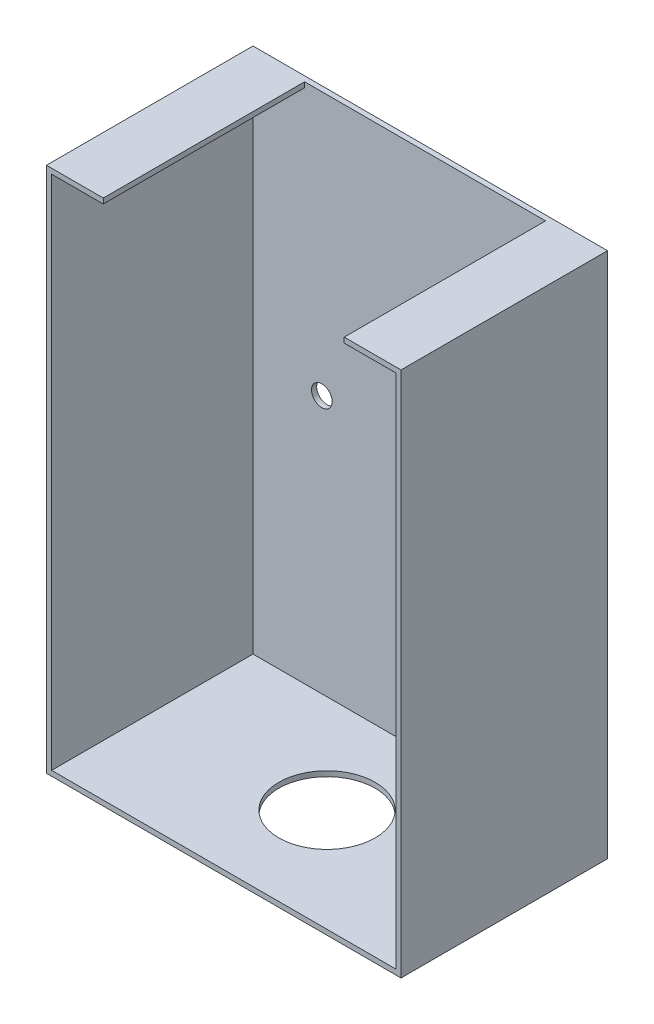
ISO-10303-21;
HEADER;
FILE_DESCRIPTION(('STEP AP214'),'2;1');
FILE_NAME('part.step','',(''),(''),'','','');
FILE_SCHEMA(('AUTOMOTIVE_DESIGN { 1 0 10303 214 1 1 1 1 }'));
ENDSEC;
DATA;
#1=APPLICATION_CONTEXT('core data for automotive mechanical design processes');
#2=APPLICATION_PROTOCOL_DEFINITION('international standard','automotive_design',2000,#1);
#3=PRODUCT_CONTEXT('',#1,'mechanical');
#4=PRODUCT('Part','Part','',(#3));
#5=PRODUCT_RELATED_PRODUCT_CATEGORY('part','',(#4));
#6=PRODUCT_DEFINITION_FORMATION('','',#4);
#7=PRODUCT_DEFINITION_CONTEXT('part definition',#1,'design');
#8=PRODUCT_DEFINITION('design','',#6,#7);
#9=PRODUCT_DEFINITION_SHAPE('','',#8);
#10=(LENGTH_UNIT() NAMED_UNIT(*) SI_UNIT(.MILLI.,.METRE.));
#11=(NAMED_UNIT(*) PLANE_ANGLE_UNIT() SI_UNIT($,.RADIAN.));
#12=(NAMED_UNIT(*) SI_UNIT($,.STERADIAN.) SOLID_ANGLE_UNIT());
#13=UNCERTAINTY_MEASURE_WITH_UNIT(LENGTH_MEASURE(1.E-05),#10,'distance_accuracy_value','');
#14=(GEOMETRIC_REPRESENTATION_CONTEXT(3) GLOBAL_UNCERTAINTY_ASSIGNED_CONTEXT((#13)) GLOBAL_UNIT_ASSIGNED_CONTEXT((#10,
#11,#12)) REPRESENTATION_CONTEXT('',''));
#15=CARTESIAN_POINT('',(0.,0.,0.));
#16=DIRECTION('',(0.,0.,1.));
#17=DIRECTION('',(1.,0.,0.));
#18=AXIS2_PLACEMENT_3D('',#15,#16,#17);
#19=CARTESIAN_POINT('',(50.,-76.5,60.));
#20=DIRECTION('',(-1.,0.,0.));
#21=DIRECTION('',(0.,0.,1.));
#22=AXIS2_PLACEMENT_3D('',#19,#20,#21);
#23=PLANE('',#22);
#24=DIRECTION('',(0.,1.,0.));
#25=VECTOR('',#24,1.);
#26=CARTESIAN_POINT('',(50.,-76.5,60.));
#27=LINE('',#26,#25);
#28=CARTESIAN_POINT('',(50.,-75.,60.));
#29=VERTEX_POINT('',#28);
#30=CARTESIAN_POINT('',(50.,75.,60.));
#31=VERTEX_POINT('',#30);
#32=EDGE_CURVE('E220',#29,#31,#27,.T.);
#33=ORIENTED_EDGE('',*,*,#32,.T.);
#34=DIRECTION('',(0.,0.,1.));
#35=VECTOR('',#34,1.);
#36=CARTESIAN_POINT('',(50.,75.,1.5));
#37=LINE('',#36,#35);
#38=CARTESIAN_POINT('',(50.,75.,1.5));
#39=VERTEX_POINT('',#38);
#40=EDGE_CURVE('E169',#39,#31,#37,.T.);
#41=ORIENTED_EDGE('',*,*,#40,.F.);
#42=DIRECTION('',(0.,1.,0.));
#43=VECTOR('',#42,1.);
#44=CARTESIAN_POINT('',(50.,-76.5,1.5));
#45=LINE('',#44,#43);
#46=CARTESIAN_POINT('',(50.,-75.,1.5));
#47=VERTEX_POINT('',#46);
#48=EDGE_CURVE('E216',#47,#39,#45,.T.);
#49=ORIENTED_EDGE('',*,*,#48,.F.);
#50=DIRECTION('',(0.,0.,-1.));
#51=VECTOR('',#50,1.);
#52=CARTESIAN_POINT('',(50.,-75.,60.));
#53=LINE('',#52,#51);
#54=EDGE_CURVE('E213',#29,#47,#53,.T.);
#55=ORIENTED_EDGE('',*,*,#54,.F.);
#56=EDGE_LOOP('',(#33,#41,#49,#55));
#57=FACE_BOUND('',#56,.T.);
#58=ADVANCED_FACE('F38',(#57),#23,.T.);
#59=CARTESIAN_POINT('',(0.,0.,1.5));
#60=DIRECTION('',(0.,0.,1.));
#61=DIRECTION('',(1.,0.,0.));
#62=AXIS2_PLACEMENT_3D('',#59,#60,#61);
#63=PLANE('',#62);
#64=CARTESIAN_POINT('',(30.,0.,1.5));
#65=DIRECTION('',(0.,0.,1.));
#66=DIRECTION('',(1.,0.,0.));
#67=AXIS2_PLACEMENT_3D('',#64,#65,#66);
#68=CIRCLE('',#67,3.);
#69=CARTESIAN_POINT('',(33.,0.,1.5));
#70=VERTEX_POINT('',#69);
#71=EDGE_CURVE('E462',#70,#70,#68,.F.);
#72=ORIENTED_EDGE('',*,*,#71,.T.);
#73=EDGE_LOOP('',(#72));
#74=FACE_BOUND('',#73,.T.);
#75=CARTESIAN_POINT('',(-30.,0.,1.5));
#76=DIRECTION('',(0.,0.,1.));
#77=DIRECTION('',(1.,0.,0.));
#78=AXIS2_PLACEMENT_3D('',#75,#76,#77);
#79=CIRCLE('',#78,3.);
#80=CARTESIAN_POINT('',(-27.,0.,1.5));
#81=VERTEX_POINT('',#80);
#82=EDGE_CURVE('E474',#81,#81,#79,.F.);
#83=ORIENTED_EDGE('',*,*,#82,.T.);
#84=EDGE_LOOP('',(#83));
#85=FACE_BOUND('',#84,.T.);
#86=DIRECTION('',(-1.,0.,0.));
#87=VECTOR('',#86,1.);
#88=CARTESIAN_POINT('',(-35.,75.,1.5));
#89=LINE('',#88,#87);
#90=CARTESIAN_POINT('',(-35.,75.,1.5));
#91=VERTEX_POINT('',#90);
#92=CARTESIAN_POINT('',(-50.,75.,1.5));
#93=VERTEX_POINT('',#92);
#94=EDGE_CURVE('E157',#91,#93,#89,.T.);
#95=ORIENTED_EDGE('',*,*,#94,.T.);
#96=DIRECTION('',(0.,-1.,0.));
#97=VECTOR('',#96,1.);
#98=CARTESIAN_POINT('',(-50.,-76.5,1.5));
#99=LINE('',#98,#97);
#100=CARTESIAN_POINT('',(-50.,-75.,1.5));
#101=VERTEX_POINT('',#100);
#102=EDGE_CURVE('E201',#93,#101,#99,.T.);
#103=ORIENTED_EDGE('',*,*,#102,.T.);
#104=DIRECTION('',(1.,0.,0.));
#105=VECTOR('',#104,1.);
#106=CARTESIAN_POINT('',(51.5,-75.,1.5));
#107=LINE('',#106,#105);
#108=EDGE_CURVE('E207',#101,#47,#107,.T.);
#109=ORIENTED_EDGE('',*,*,#108,.T.);
#110=ORIENTED_EDGE('',*,*,#48,.T.);
#111=DIRECTION('',(1.,0.,0.));
#112=VECTOR('',#111,1.);
#113=CARTESIAN_POINT('',(35.,75.,1.5));
#114=LINE('',#113,#112);
#115=CARTESIAN_POINT('',(35.,75.,1.5));
#116=VERTEX_POINT('',#115);
#117=EDGE_CURVE('E192',#116,#39,#114,.T.);
#118=ORIENTED_EDGE('',*,*,#117,.F.);
#119=DIRECTION('',(0.,-1.,0.));
#120=VECTOR('',#119,1.);
#121=CARTESIAN_POINT('',(35.,76.5,1.5));
#122=LINE('',#121,#120);
#123=CARTESIAN_POINT('',(35.,76.5,1.5));
#124=VERTEX_POINT('',#123);
#125=EDGE_CURVE('E170',#124,#116,#122,.T.);
#126=ORIENTED_EDGE('',*,*,#125,.F.);
#127=DIRECTION('',(-1.,0.,0.));
#128=VECTOR('',#127,1.);
#129=CARTESIAN_POINT('',(51.5,76.5,1.5));
#130=LINE('',#129,#128);
#131=CARTESIAN_POINT('',(-35.,76.5,1.5));
#132=VERTEX_POINT('',#131);
#133=EDGE_CURVE('E59',#124,#132,#130,.T.);
#134=ORIENTED_EDGE('',*,*,#133,.T.);
#135=DIRECTION('',(0.,-1.,0.));
#136=VECTOR('',#135,1.);
#137=CARTESIAN_POINT('',(-35.,76.5,1.5));
#138=LINE('',#137,#136);
#139=EDGE_CURVE('E54',#132,#91,#138,.T.);
#140=ORIENTED_EDGE('',*,*,#139,.T.);
#141=EDGE_LOOP('',(#95,#103,#109,#110,#118,#126,#134,#140));
#142=FACE_BOUND('',#141,.T.);
#143=ADVANCED_FACE('F285',(#74,#85,#142),#63,.T.);
#144=CARTESIAN_POINT('',(-51.5,-76.5,60.));
#145=DIRECTION('',(1.,0.,0.));
#146=DIRECTION('',(0.,0.,-1.));
#147=AXIS2_PLACEMENT_3D('',#144,#145,#146);
#148=PLANE('',#147);
#149=DIRECTION('',(0.,-1.,0.));
#150=VECTOR('',#149,1.);
#151=CARTESIAN_POINT('',(-51.5,-76.5,0.));
#152=LINE('',#151,#150);
#153=CARTESIAN_POINT('',(-51.5,76.5,0.));
#154=VERTEX_POINT('',#153);
#155=CARTESIAN_POINT('',(-51.5,-76.5,0.));
#156=VERTEX_POINT('',#155);
#157=EDGE_CURVE('E212',#154,#156,#152,.T.);
#158=ORIENTED_EDGE('',*,*,#157,.T.);
#159=DIRECTION('',(0.,0.,-1.));
#160=VECTOR('',#159,1.);
#161=CARTESIAN_POINT('',(-51.5,-76.5,60.));
#162=LINE('',#161,#160);
#163=CARTESIAN_POINT('',(-51.5,-76.5,60.));
#164=VERTEX_POINT('',#163);
#165=EDGE_CURVE('E11',#164,#156,#162,.T.);
#166=ORIENTED_EDGE('',*,*,#165,.F.);
#167=DIRECTION('',(0.,-1.,0.));
#168=VECTOR('',#167,1.);
#169=CARTESIAN_POINT('',(-51.5,-76.5,60.));
#170=LINE('',#169,#168);
#171=CARTESIAN_POINT('',(-51.5,76.5,60.));
#172=VERTEX_POINT('',#171);
#173=EDGE_CURVE('E235',#172,#164,#170,.T.);
#174=ORIENTED_EDGE('',*,*,#173,.F.);
#175=DIRECTION('',(0.,0.,-1.));
#176=VECTOR('',#175,1.);
#177=CARTESIAN_POINT('',(-51.5,76.5,60.));
#178=LINE('',#177,#176);
#179=EDGE_CURVE('E132',#172,#154,#178,.T.);
#180=ORIENTED_EDGE('',*,*,#179,.T.);
#181=EDGE_LOOP('',(#158,#166,#174,#180));
#182=FACE_BOUND('',#181,.T.);
#183=ADVANCED_FACE('F40',(#182),#148,.F.);
#184=CARTESIAN_POINT('',(51.5,-76.5,60.));
#185=DIRECTION('',(0.,1.,0.));
#186=DIRECTION('',(0.,0.,1.));
#187=AXIS2_PLACEMENT_3D('',#184,#185,#186);
#188=PLANE('',#187);
#189=CARTESIAN_POINT('',(0.,-76.5,30.));
#190=DIRECTION('',(0.,-1.,0.));
#191=DIRECTION('',(0.,0.,-1.));
#192=AXIS2_PLACEMENT_3D('',#189,#190,#191);
#193=CIRCLE('',#192,14.);
#194=CARTESIAN_POINT('',(0.,-76.5,16.));
#195=VERTEX_POINT('',#194);
#196=EDGE_CURVE('E197',#195,#195,#193,.T.);
#197=ORIENTED_EDGE('',*,*,#196,.F.);
#198=EDGE_LOOP('',(#197));
#199=FACE_BOUND('',#198,.T.);
#200=DIRECTION('',(1.,0.,0.));
#201=VECTOR('',#200,1.);
#202=CARTESIAN_POINT('',(51.5,-76.5,0.));
#203=LINE('',#202,#201);
#204=CARTESIAN_POINT('',(51.5,-76.5,0.));
#205=VERTEX_POINT('',#204);
#206=EDGE_CURVE('E248',#156,#205,#203,.T.);
#207=ORIENTED_EDGE('',*,*,#206,.T.);
#208=DIRECTION('',(0.,0.,-1.));
#209=VECTOR('',#208,1.);
#210=CARTESIAN_POINT('',(51.5,-76.5,60.));
#211=LINE('',#210,#209);
#212=CARTESIAN_POINT('',(51.5,-76.5,60.));
#213=VERTEX_POINT('',#212);
#214=EDGE_CURVE('E47',#213,#205,#211,.T.);
#215=ORIENTED_EDGE('',*,*,#214,.F.);
#216=DIRECTION('',(1.,0.,0.));
#217=VECTOR('',#216,1.);
#218=CARTESIAN_POINT('',(51.5,-76.5,60.));
#219=LINE('',#218,#217);
#220=EDGE_CURVE('E238',#164,#213,#219,.T.);
#221=ORIENTED_EDGE('',*,*,#220,.F.);
#222=ORIENTED_EDGE('',*,*,#165,.T.);
#223=EDGE_LOOP('',(#207,#215,#221,#222));
#224=FACE_BOUND('',#223,.T.);
#225=ADVANCED_FACE('F277',(#199,#224),#188,.F.);
#226=CARTESIAN_POINT('',(51.5,-76.5,60.));
#227=DIRECTION('',(-1.,0.,0.));
#228=DIRECTION('',(0.,0.,1.));
#229=AXIS2_PLACEMENT_3D('',#226,#227,#228);
#230=PLANE('',#229);
#231=DIRECTION('',(0.,1.,0.));
#232=VECTOR('',#231,1.);
#233=CARTESIAN_POINT('',(51.5,-76.5,0.));
#234=LINE('',#233,#232);
#235=CARTESIAN_POINT('',(51.5,76.5,0.));
#236=VERTEX_POINT('',#235);
#237=EDGE_CURVE('E251',#205,#236,#234,.T.);
#238=ORIENTED_EDGE('',*,*,#237,.T.);
#239=DIRECTION('',(0.,0.,-1.));
#240=VECTOR('',#239,1.);
#241=CARTESIAN_POINT('',(51.5,76.5,60.));
#242=LINE('',#241,#240);
#243=CARTESIAN_POINT('',(51.5,76.5,60.));
#244=VERTEX_POINT('',#243);
#245=EDGE_CURVE('E258',#244,#236,#242,.T.);
#246=ORIENTED_EDGE('',*,*,#245,.F.);
#247=DIRECTION('',(0.,1.,0.));
#248=VECTOR('',#247,1.);
#249=CARTESIAN_POINT('',(51.5,-76.5,60.));
#250=LINE('',#249,#248);
#251=EDGE_CURVE('E139',#213,#244,#250,.T.);
#252=ORIENTED_EDGE('',*,*,#251,.F.);
#253=ORIENTED_EDGE('',*,*,#214,.T.);
#254=EDGE_LOOP('',(#238,#246,#252,#253));
#255=FACE_BOUND('',#254,.T.);
#256=ADVANCED_FACE('F267',(#255),#230,.F.);
#257=CARTESIAN_POINT('',(51.5,76.5,60.));
#258=DIRECTION('',(0.,-1.,0.));
#259=DIRECTION('',(1.,0.,0.));
#260=AXIS2_PLACEMENT_3D('',#257,#258,#259);
#261=PLANE('',#260);
#262=DIRECTION('',(-1.,0.,0.));
#263=VECTOR('',#262,1.);
#264=CARTESIAN_POINT('',(51.5,76.5,60.));
#265=LINE('',#264,#263);
#266=CARTESIAN_POINT('',(-35.,76.5,60.));
#267=VERTEX_POINT('',#266);
#268=EDGE_CURVE('E127',#267,#172,#265,.T.);
#269=ORIENTED_EDGE('',*,*,#268,.F.);
#270=DIRECTION('',(0.,0.,-1.));
#271=VECTOR('',#270,1.);
#272=CARTESIAN_POINT('',(-35.,76.5,1.5));
#273=LINE('',#272,#271);
#274=EDGE_CURVE('E130',#267,#132,#273,.T.);
#275=ORIENTED_EDGE('',*,*,#274,.T.);
#276=ORIENTED_EDGE('',*,*,#133,.F.);
#277=DIRECTION('',(0.,0.,-1.));
#278=VECTOR('',#277,1.);
#279=CARTESIAN_POINT('',(35.,76.5,1.5));
#280=LINE('',#279,#278);
#281=CARTESIAN_POINT('',(35.,76.5,60.));
#282=VERTEX_POINT('',#281);
#283=EDGE_CURVE('E181',#282,#124,#280,.T.);
#284=ORIENTED_EDGE('',*,*,#283,.F.);
#285=EDGE_CURVE('E138',#244,#282,#265,.T.);
#286=ORIENTED_EDGE('',*,*,#285,.F.);
#287=ORIENTED_EDGE('',*,*,#245,.T.);
#288=DIRECTION('',(-1.,0.,0.));
#289=VECTOR('',#288,1.);
#290=CARTESIAN_POINT('',(51.5,76.5,0.));
#291=LINE('',#290,#289);
#292=EDGE_CURVE('E239',#236,#154,#291,.T.);
#293=ORIENTED_EDGE('',*,*,#292,.T.);
#294=ORIENTED_EDGE('',*,*,#179,.F.);
#295=EDGE_LOOP('',(#269,#275,#276,#284,#286,#287,#293,#294));
#296=FACE_BOUND('',#295,.T.);
#297=ADVANCED_FACE('F129',(#296),#261,.F.);
#298=CARTESIAN_POINT('',(0.,0.,60.));
#299=DIRECTION('',(0.,0.,1.));
#300=DIRECTION('',(1.,0.,0.));
#301=AXIS2_PLACEMENT_3D('',#298,#299,#300);
#302=PLANE('',#301);
#303=DIRECTION('',(0.,-1.,0.));
#304=VECTOR('',#303,1.);
#305=CARTESIAN_POINT('',(-50.,-76.5,60.));
#306=LINE('',#305,#304);
#307=CARTESIAN_POINT('',(-50.,75.,60.));
#308=VERTEX_POINT('',#307);
#309=CARTESIAN_POINT('',(-50.,-75.,60.));
#310=VERTEX_POINT('',#309);
#311=EDGE_CURVE('E224',#308,#310,#306,.T.);
#312=ORIENTED_EDGE('',*,*,#311,.F.);
#313=DIRECTION('',(-1.,0.,0.));
#314=VECTOR('',#313,1.);
#315=CARTESIAN_POINT('',(-35.,75.,60.));
#316=LINE('',#315,#314);
#317=CARTESIAN_POINT('',(-35.,75.,60.));
#318=VERTEX_POINT('',#317);
#319=EDGE_CURVE('E152',#318,#308,#316,.T.);
#320=ORIENTED_EDGE('',*,*,#319,.F.);
#321=DIRECTION('',(0.,1.,0.));
#322=VECTOR('',#321,1.);
#323=CARTESIAN_POINT('',(-35.,76.5,60.));
#324=LINE('',#323,#322);
#325=EDGE_CURVE('E145',#318,#267,#324,.T.);
#326=ORIENTED_EDGE('',*,*,#325,.T.);
#327=ORIENTED_EDGE('',*,*,#268,.T.);
#328=ORIENTED_EDGE('',*,*,#173,.T.);
#329=ORIENTED_EDGE('',*,*,#220,.T.);
#330=ORIENTED_EDGE('',*,*,#251,.T.);
#331=ORIENTED_EDGE('',*,*,#285,.T.);
#332=DIRECTION('',(0.,1.,0.));
#333=VECTOR('',#332,1.);
#334=CARTESIAN_POINT('',(35.,76.5,60.));
#335=LINE('',#334,#333);
#336=CARTESIAN_POINT('',(35.,75.,60.));
#337=VERTEX_POINT('',#336);
#338=EDGE_CURVE('E177',#337,#282,#335,.T.);
#339=ORIENTED_EDGE('',*,*,#338,.F.);
#340=DIRECTION('',(1.,0.,0.));
#341=VECTOR('',#340,1.);
#342=CARTESIAN_POINT('',(35.,75.,60.));
#343=LINE('',#342,#341);
#344=EDGE_CURVE('E185',#337,#31,#343,.T.);
#345=ORIENTED_EDGE('',*,*,#344,.T.);
#346=ORIENTED_EDGE('',*,*,#32,.F.);
#347=DIRECTION('',(1.,0.,0.));
#348=VECTOR('',#347,1.);
#349=CARTESIAN_POINT('',(51.5,-75.,60.));
#350=LINE('',#349,#348);
#351=EDGE_CURVE('E227',#310,#29,#350,.T.);
#352=ORIENTED_EDGE('',*,*,#351,.F.);
#353=EDGE_LOOP('',(#312,#320,#326,#327,#328,#329,#330,#331,#339,#345,#346,#352));
#354=FACE_BOUND('',#353,.T.);
#355=ADVANCED_FACE('F150',(#354),#302,.T.);
#356=CARTESIAN_POINT('',(0.,0.,0.));
#357=DIRECTION('',(0.,0.,1.));
#358=DIRECTION('',(1.,0.,0.));
#359=AXIS2_PLACEMENT_3D('',#356,#357,#358);
#360=PLANE('',#359);
#361=CARTESIAN_POINT('',(30.,0.,0.));
#362=DIRECTION('',(0.,0.,-1.));
#363=DIRECTION('',(-1.,0.,0.));
#364=AXIS2_PLACEMENT_3D('',#361,#362,#363);
#365=CIRCLE('',#364,3.);
#366=CARTESIAN_POINT('',(27.,0.,0.));
#367=VERTEX_POINT('',#366);
#368=EDGE_CURVE('E164',#367,#367,#365,.T.);
#369=ORIENTED_EDGE('',*,*,#368,.F.);
#370=EDGE_LOOP('',(#369));
#371=FACE_BOUND('',#370,.T.);
#372=CARTESIAN_POINT('',(-30.,0.,0.));
#373=DIRECTION('',(0.,0.,-1.));
#374=DIRECTION('',(1.,0.,0.));
#375=AXIS2_PLACEMENT_3D('',#372,#373,#374);
#376=CIRCLE('',#375,3.);
#377=CARTESIAN_POINT('',(-27.,0.,0.));
#378=VERTEX_POINT('',#377);
#379=EDGE_CURVE('E468',#378,#378,#376,.T.);
#380=ORIENTED_EDGE('',*,*,#379,.F.);
#381=EDGE_LOOP('',(#380));
#382=FACE_BOUND('',#381,.T.);
#383=ORIENTED_EDGE('',*,*,#157,.F.);
#384=ORIENTED_EDGE('',*,*,#292,.F.);
#385=ORIENTED_EDGE('',*,*,#237,.F.);
#386=ORIENTED_EDGE('',*,*,#206,.F.);
#387=EDGE_LOOP('',(#383,#384,#385,#386));
#388=FACE_BOUND('',#387,.T.);
#389=ADVANCED_FACE('F273',(#371,#382,#388),#360,.F.);
#390=CARTESIAN_POINT('',(-50.,-76.5,60.));
#391=DIRECTION('',(1.,0.,0.));
#392=DIRECTION('',(0.,0.,-1.));
#393=AXIS2_PLACEMENT_3D('',#390,#391,#392);
#394=PLANE('',#393);
#395=DIRECTION('',(0.,0.,1.));
#396=VECTOR('',#395,1.);
#397=CARTESIAN_POINT('',(-50.,75.,1.5));
#398=LINE('',#397,#396);
#399=EDGE_CURVE('E161',#93,#308,#398,.T.);
#400=ORIENTED_EDGE('',*,*,#399,.T.);
#401=ORIENTED_EDGE('',*,*,#311,.T.);
#402=DIRECTION('',(0.,0.,-1.));
#403=VECTOR('',#402,1.);
#404=CARTESIAN_POINT('',(-50.,-75.,60.));
#405=LINE('',#404,#403);
#406=EDGE_CURVE('E208',#310,#101,#405,.T.);
#407=ORIENTED_EDGE('',*,*,#406,.T.);
#408=ORIENTED_EDGE('',*,*,#102,.F.);
#409=EDGE_LOOP('',(#400,#401,#407,#408));
#410=FACE_BOUND('',#409,.T.);
#411=ADVANCED_FACE('F305',(#410),#394,.T.);
#412=CARTESIAN_POINT('',(51.5,-75.,60.));
#413=DIRECTION('',(0.,1.,0.));
#414=DIRECTION('',(0.,0.,1.));
#415=AXIS2_PLACEMENT_3D('',#412,#413,#414);
#416=PLANE('',#415);
#417=CARTESIAN_POINT('',(0.,-75.,30.));
#418=DIRECTION('',(0.,1.,0.));
#419=DIRECTION('',(0.,0.,1.));
#420=AXIS2_PLACEMENT_3D('',#417,#418,#419);
#421=CIRCLE('',#420,14.);
#422=CARTESIAN_POINT('',(0.,-75.,44.));
#423=VERTEX_POINT('',#422);
#424=EDGE_CURVE('E196',#423,#423,#421,.F.);
#425=ORIENTED_EDGE('',*,*,#424,.T.);
#426=EDGE_LOOP('',(#425));
#427=FACE_BOUND('',#426,.T.);
#428=ORIENTED_EDGE('',*,*,#108,.F.);
#429=ORIENTED_EDGE('',*,*,#406,.F.);
#430=ORIENTED_EDGE('',*,*,#351,.T.);
#431=ORIENTED_EDGE('',*,*,#54,.T.);
#432=EDGE_LOOP('',(#428,#429,#430,#431));
#433=FACE_BOUND('',#432,.T.);
#434=ADVANCED_FACE('F298',(#427,#433),#416,.T.);
#435=CARTESIAN_POINT('',(0.,76.501,30.));
#436=DIRECTION('',(0.,-1.,0.));
#437=DIRECTION('',(0.,0.,-1.));
#438=AXIS2_PLACEMENT_3D('',#435,#436,#437);
#439=CYLINDRICAL_SURFACE('',#438,14.);
#440=ORIENTED_EDGE('',*,*,#424,.F.);
#441=EDGE_LOOP('',(#440));
#442=FACE_BOUND('',#441,.T.);
#443=ORIENTED_EDGE('',*,*,#196,.T.);
#444=EDGE_LOOP('',(#443));
#445=FACE_BOUND('',#444,.T.);
#446=ADVANCED_FACE('F326',(#442,#445),#439,.F.);
#447=CARTESIAN_POINT('',(35.,75.,1.5));
#448=DIRECTION('',(0.,1.,0.));
#449=DIRECTION('',(0.,0.,1.));
#450=AXIS2_PLACEMENT_3D('',#447,#448,#449);
#451=PLANE('',#450);
#452=ORIENTED_EDGE('',*,*,#40,.T.);
#453=ORIENTED_EDGE('',*,*,#344,.F.);
#454=DIRECTION('',(0.,0.,1.));
#455=VECTOR('',#454,1.);
#456=CARTESIAN_POINT('',(35.,75.,1.5));
#457=LINE('',#456,#455);
#458=EDGE_CURVE('E174',#116,#337,#457,.T.);
#459=ORIENTED_EDGE('',*,*,#458,.F.);
#460=ORIENTED_EDGE('',*,*,#117,.T.);
#461=EDGE_LOOP('',(#452,#453,#459,#460));
#462=FACE_BOUND('',#461,.T.);
#463=ADVANCED_FACE('F322',(#462),#451,.F.);
#464=CARTESIAN_POINT('',(35.,0.,0.));
#465=DIRECTION('',(-1.,0.,0.));
#466=DIRECTION('',(0.,0.,1.));
#467=AXIS2_PLACEMENT_3D('',#464,#465,#466);
#468=PLANE('',#467);
#469=ORIENTED_EDGE('',*,*,#125,.T.);
#470=ORIENTED_EDGE('',*,*,#458,.T.);
#471=ORIENTED_EDGE('',*,*,#338,.T.);
#472=ORIENTED_EDGE('',*,*,#283,.T.);
#473=EDGE_LOOP('',(#469,#470,#471,#472));
#474=FACE_BOUND('',#473,.T.);
#475=ADVANCED_FACE('F325',(#474),#468,.T.);
#476=CARTESIAN_POINT('',(-35.,75.,1.5));
#477=DIRECTION('',(0.,-1.,0.));
#478=DIRECTION('',(0.,0.,-1.));
#479=AXIS2_PLACEMENT_3D('',#476,#477,#478);
#480=PLANE('',#479);
#481=ORIENTED_EDGE('',*,*,#399,.F.);
#482=ORIENTED_EDGE('',*,*,#94,.F.);
#483=DIRECTION('',(0.,0.,1.));
#484=VECTOR('',#483,1.);
#485=CARTESIAN_POINT('',(-35.,75.,1.5));
#486=LINE('',#485,#484);
#487=EDGE_CURVE('E154',#91,#318,#486,.T.);
#488=ORIENTED_EDGE('',*,*,#487,.T.);
#489=ORIENTED_EDGE('',*,*,#319,.T.);
#490=EDGE_LOOP('',(#481,#482,#488,#489));
#491=FACE_BOUND('',#490,.T.);
#492=ADVANCED_FACE('F333',(#491),#480,.T.);
#493=CARTESIAN_POINT('',(-35.,0.,0.));
#494=DIRECTION('',(1.,0.,0.));
#495=DIRECTION('',(0.,0.,1.));
#496=AXIS2_PLACEMENT_3D('',#493,#494,#495);
#497=PLANE('',#496);
#498=ORIENTED_EDGE('',*,*,#139,.F.);
#499=ORIENTED_EDGE('',*,*,#274,.F.);
#500=ORIENTED_EDGE('',*,*,#325,.F.);
#501=ORIENTED_EDGE('',*,*,#487,.F.);
#502=EDGE_LOOP('',(#498,#499,#500,#501));
#503=FACE_BOUND('',#502,.T.);
#504=ADVANCED_FACE('F143',(#503),#497,.T.);
#505=CARTESIAN_POINT('',(-30.,0.,60.001));
#506=DIRECTION('',(0.,0.,-1.));
#507=DIRECTION('',(-1.,0.,0.));
#508=AXIS2_PLACEMENT_3D('',#505,#506,#507);
#509=CYLINDRICAL_SURFACE('',#508,3.);
#510=ORIENTED_EDGE('',*,*,#82,.F.);
#511=EDGE_LOOP('',(#510));
#512=FACE_BOUND('',#511,.T.);
#513=ORIENTED_EDGE('',*,*,#379,.T.);
#514=EDGE_LOOP('',(#513));
#515=FACE_BOUND('',#514,.T.);
#516=ADVANCED_FACE('F348',(#512,#515),#509,.F.);
#517=CARTESIAN_POINT('',(30.,0.,60.001));
#518=DIRECTION('',(0.,0.,-1.));
#519=DIRECTION('',(-1.,0.,0.));
#520=AXIS2_PLACEMENT_3D('',#517,#518,#519);
#521=CYLINDRICAL_SURFACE('',#520,3.);
#522=ORIENTED_EDGE('',*,*,#71,.F.);
#523=EDGE_LOOP('',(#522));
#524=FACE_BOUND('',#523,.T.);
#525=ORIENTED_EDGE('',*,*,#368,.T.);
#526=EDGE_LOOP('',(#525));
#527=FACE_BOUND('',#526,.T.);
#528=ADVANCED_FACE('F355',(#524,#527),#521,.F.);
#529=CLOSED_SHELL('',(#58,#143,#183,#225,#256,#297,#355,#389,#411,#434,#446,#463,#475,#492,#504,
#516,#528));
#530=MANIFOLD_SOLID_BREP('B2',#529);
#531=ADVANCED_BREP_SHAPE_REPRESENTATION('',(#18,#530),#14);
#532=SHAPE_DEFINITION_REPRESENTATION(#9,#531);
ENDSEC;
END-ISO-10303-21;
